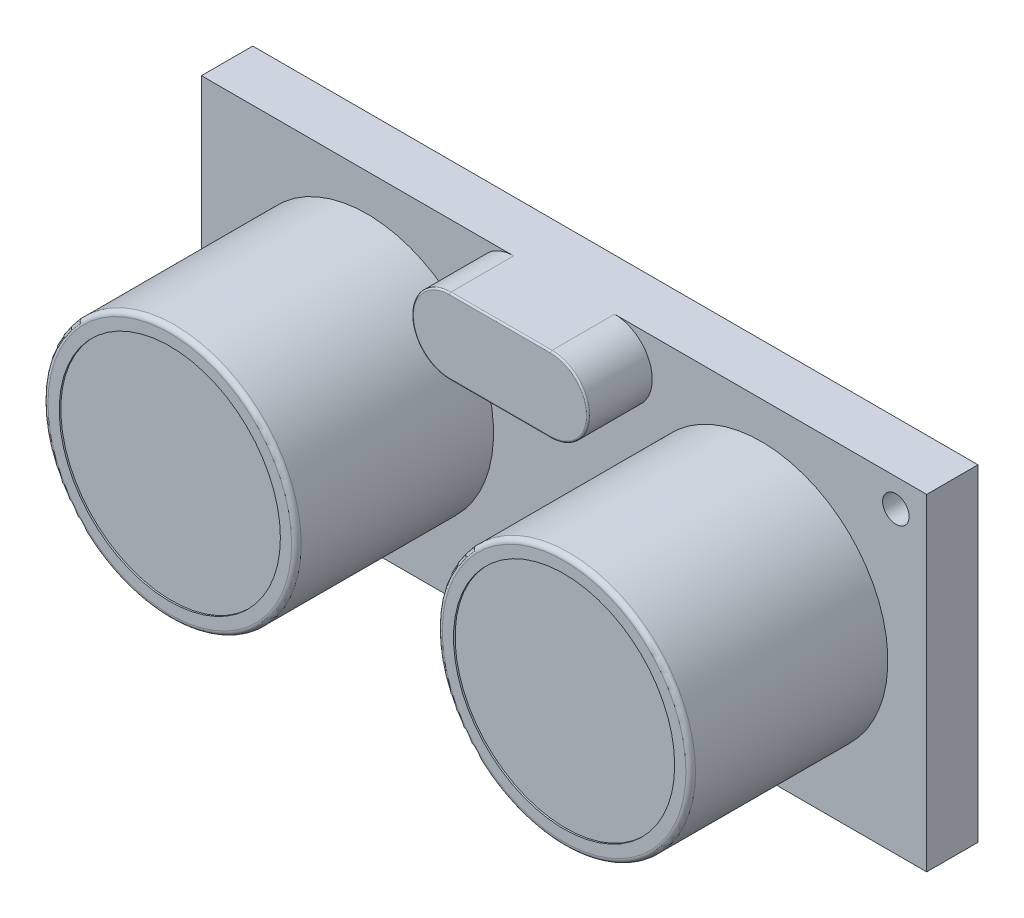
ISO-10303-21;
HEADER;
FILE_DESCRIPTION(('STEP AP214'),'2;1');
FILE_NAME('part.step','',(''),(''),'','','');
FILE_SCHEMA(('AUTOMOTIVE_DESIGN { 1 0 10303 214 1 1 1 1 }'));
ENDSEC;
DATA;
#1=APPLICATION_CONTEXT('core data for automotive mechanical design processes');
#2=APPLICATION_PROTOCOL_DEFINITION('international standard','automotive_design',2000,#1);
#3=PRODUCT_CONTEXT('',#1,'mechanical');
#4=PRODUCT('Part','Part','',(#3));
#5=PRODUCT_RELATED_PRODUCT_CATEGORY('part','',(#4));
#6=PRODUCT_DEFINITION_FORMATION('','',#4);
#7=PRODUCT_DEFINITION_CONTEXT('part definition',#1,'design');
#8=PRODUCT_DEFINITION('design','',#6,#7);
#9=PRODUCT_DEFINITION_SHAPE('','',#8);
#10=(LENGTH_UNIT() NAMED_UNIT(*) SI_UNIT(.MILLI.,.METRE.));
#11=(NAMED_UNIT(*) PLANE_ANGLE_UNIT() SI_UNIT($,.RADIAN.));
#12=(NAMED_UNIT(*) SI_UNIT($,.STERADIAN.) SOLID_ANGLE_UNIT());
#13=UNCERTAINTY_MEASURE_WITH_UNIT(LENGTH_MEASURE(1.E-05),#10,'distance_accuracy_value','');
#14=(GEOMETRIC_REPRESENTATION_CONTEXT(3) GLOBAL_UNCERTAINTY_ASSIGNED_CONTEXT((#13)) GLOBAL_UNIT_ASSIGNED_CONTEXT((#10,
#11,#12)) REPRESENTATION_CONTEXT('',''));
#15=CARTESIAN_POINT('',(0.,0.,0.));
#16=DIRECTION('',(0.,0.,1.));
#17=DIRECTION('',(1.,0.,0.));
#18=AXIS2_PLACEMENT_3D('',#15,#16,#17);
#19=CARTESIAN_POINT('',(-5.15,-7.7,-4.5));
#20=DIRECTION('',(1.,0.,0.));
#21=DIRECTION('',(0.,0.,-1.));
#22=AXIS2_PLACEMENT_3D('',#19,#20,#21);
#23=PLANE('',#22);
#24=DIRECTION('',(0.,1.,0.));
#25=VECTOR('',#24,1.);
#26=CARTESIAN_POINT('',(-5.15,-7.7,0.));
#27=LINE('',#26,#25);
#28=CARTESIAN_POINT('',(-5.15,-10.2,0.));
#29=VERTEX_POINT('',#28);
#30=CARTESIAN_POINT('',(-5.15,-7.7,0.));
#31=VERTEX_POINT('',#30);
#32=EDGE_CURVE('E111',#29,#31,#27,.T.);
#33=ORIENTED_EDGE('',*,*,#32,.T.);
#34=DIRECTION('',(0.,0.,1.));
#35=VECTOR('',#34,1.);
#36=CARTESIAN_POINT('',(-5.15,-7.7,-4.5));
#37=LINE('',#36,#35);
#38=CARTESIAN_POINT('',(-5.15,-7.7,-4.5));
#39=VERTEX_POINT('',#38);
#40=EDGE_CURVE('E102',#39,#31,#37,.T.);
#41=ORIENTED_EDGE('',*,*,#40,.F.);
#42=DIRECTION('',(0.,1.,0.));
#43=VECTOR('',#42,1.);
#44=CARTESIAN_POINT('',(-5.15,-7.7,-4.5));
#45=LINE('',#44,#43);
#46=CARTESIAN_POINT('',(-5.15,-10.2,-4.5));
#47=VERTEX_POINT('',#46);
#48=EDGE_CURVE('E96',#47,#39,#45,.T.);
#49=ORIENTED_EDGE('',*,*,#48,.F.);
#50=DIRECTION('',(0.,0.,1.));
#51=VECTOR('',#50,1.);
#52=CARTESIAN_POINT('',(-5.15,-10.2,-4.5));
#53=LINE('',#52,#51);
#54=EDGE_CURVE('E107',#47,#29,#53,.T.);
#55=ORIENTED_EDGE('',*,*,#54,.T.);
#56=EDGE_LOOP('',(#33,#41,#49,#55));
#57=FACE_BOUND('',#56,.T.);
#58=ADVANCED_FACE('F44',(#57),#23,.F.);
#59=CARTESIAN_POINT('',(5.15,-7.7,-4.5));
#60=DIRECTION('',(0.,-1.,0.));
#61=DIRECTION('',(0.,0.,-1.));
#62=AXIS2_PLACEMENT_3D('',#59,#60,#61);
#63=PLANE('',#62);
#64=DIRECTION('',(1.,0.,0.));
#65=VECTOR('',#64,1.);
#66=CARTESIAN_POINT('',(5.15,-7.7,0.));
#67=LINE('',#66,#65);
#68=CARTESIAN_POINT('',(5.15,-7.7,0.));
#69=VERTEX_POINT('',#68);
#70=EDGE_CURVE('E101',#31,#69,#67,.T.);
#71=ORIENTED_EDGE('',*,*,#70,.T.);
#72=DIRECTION('',(0.,0.,1.));
#73=VECTOR('',#72,1.);
#74=CARTESIAN_POINT('',(5.15,-7.7,-4.5));
#75=LINE('',#74,#73);
#76=CARTESIAN_POINT('',(5.15,-7.7,-4.5));
#77=VERTEX_POINT('',#76);
#78=EDGE_CURVE('E99',#77,#69,#75,.T.);
#79=ORIENTED_EDGE('',*,*,#78,.F.);
#80=DIRECTION('',(1.,0.,0.));
#81=VECTOR('',#80,1.);
#82=CARTESIAN_POINT('',(5.15,-7.7,-4.5));
#83=LINE('',#82,#81);
#84=EDGE_CURVE('E91',#39,#77,#83,.T.);
#85=ORIENTED_EDGE('',*,*,#84,.F.);
#86=ORIENTED_EDGE('',*,*,#40,.T.);
#87=EDGE_LOOP('',(#71,#79,#85,#86));
#88=FACE_BOUND('',#87,.T.);
#89=ADVANCED_FACE('F100',(#88),#63,.F.);
#90=CARTESIAN_POINT('',(5.15,-7.7,-4.5));
#91=DIRECTION('',(-1.,0.,0.));
#92=DIRECTION('',(0.,0.,1.));
#93=AXIS2_PLACEMENT_3D('',#90,#91,#92);
#94=PLANE('',#93);
#95=DIRECTION('',(0.,-1.,0.));
#96=VECTOR('',#95,1.);
#97=CARTESIAN_POINT('',(5.15,-7.7,0.));
#98=LINE('',#97,#96);
#99=CARTESIAN_POINT('',(5.15,-10.2,0.));
#100=VERTEX_POINT('',#99);
#101=EDGE_CURVE('E77',#69,#100,#98,.T.);
#102=ORIENTED_EDGE('',*,*,#101,.T.);
#103=DIRECTION('',(0.,0.,1.));
#104=VECTOR('',#103,1.);
#105=CARTESIAN_POINT('',(5.15,-10.2,-4.5));
#106=LINE('',#105,#104);
#107=CARTESIAN_POINT('',(5.15,-10.2,-4.5));
#108=VERTEX_POINT('',#107);
#109=EDGE_CURVE('E103',#108,#100,#106,.T.);
#110=ORIENTED_EDGE('',*,*,#109,.F.);
#111=DIRECTION('',(0.,-1.,0.));
#112=VECTOR('',#111,1.);
#113=CARTESIAN_POINT('',(5.15,-7.7,-4.5));
#114=LINE('',#113,#112);
#115=EDGE_CURVE('E94',#77,#108,#114,.T.);
#116=ORIENTED_EDGE('',*,*,#115,.F.);
#117=ORIENTED_EDGE('',*,*,#78,.T.);
#118=EDGE_LOOP('',(#102,#110,#116,#117));
#119=FACE_BOUND('',#118,.T.);
#120=ADVANCED_FACE('F105',(#119),#94,.F.);
#121=CARTESIAN_POINT('',(5.15,-10.2,-4.5));
#122=DIRECTION('',(0.,1.,0.));
#123=DIRECTION('',(0.,0.,1.));
#124=AXIS2_PLACEMENT_3D('',#121,#122,#123);
#125=PLANE('',#124);
#126=CARTESIAN_POINT('',(3.60521937867282,-10.2,-3.53307553741537));
#127=DIRECTION('',(0.,1.,0.));
#128=DIRECTION('',(0.,0.,1.));
#129=AXIS2_PLACEMENT_3D('',#126,#127,#128);
#130=CIRCLE('',#129,0.600934077009731);
#131=CARTESIAN_POINT('',(3.60521937867282,-10.2,-2.93214146040564));
#132=VERTEX_POINT('',#131);
#133=EDGE_CURVE('E12',#132,#132,#130,.F.);
#134=ORIENTED_EDGE('',*,*,#133,.F.);
#135=EDGE_LOOP('',(#134));
#136=FACE_BOUND('',#135,.T.);
#137=CARTESIAN_POINT('',(1.10521937867282,-10.2,-3.53307553741537));
#138=DIRECTION('',(0.,1.,0.));
#139=DIRECTION('',(0.,0.,1.));
#140=AXIS2_PLACEMENT_3D('',#137,#138,#139);
#141=CIRCLE('',#140,0.600934077009731);
#142=CARTESIAN_POINT('',(1.10521937867282,-10.2,-2.93214146040564));
#143=VERTEX_POINT('',#142);
#144=EDGE_CURVE('E52',#143,#143,#141,.F.);
#145=ORIENTED_EDGE('',*,*,#144,.F.);
#146=EDGE_LOOP('',(#145));
#147=FACE_BOUND('',#146,.T.);
#148=CARTESIAN_POINT('',(-1.39478062132718,-10.2,-3.53307553741537));
#149=DIRECTION('',(0.,1.,0.));
#150=DIRECTION('',(0.,0.,1.));
#151=AXIS2_PLACEMENT_3D('',#148,#149,#150);
#152=CIRCLE('',#151,0.600934077009731);
#153=CARTESIAN_POINT('',(-1.39478062132718,-10.2,-2.93214146040564));
#154=VERTEX_POINT('',#153);
#155=EDGE_CURVE('E124',#154,#154,#152,.F.);
#156=ORIENTED_EDGE('',*,*,#155,.F.);
#157=EDGE_LOOP('',(#156));
#158=FACE_BOUND('',#157,.T.);
#159=CARTESIAN_POINT('',(-3.89478062132718,-10.2,-3.53307553741537));
#160=DIRECTION('',(0.,1.,0.));
#161=DIRECTION('',(0.,0.,1.));
#162=AXIS2_PLACEMENT_3D('',#159,#160,#161);
#163=CIRCLE('',#162,0.600934077009731);
#164=CARTESIAN_POINT('',(-3.89478062132718,-10.2,-2.93214146040564));
#165=VERTEX_POINT('',#164);
#166=EDGE_CURVE('E121',#165,#165,#163,.F.);
#167=ORIENTED_EDGE('',*,*,#166,.F.);
#168=EDGE_LOOP('',(#167));
#169=FACE_BOUND('',#168,.T.);
#170=DIRECTION('',(-1.,0.,0.));
#171=VECTOR('',#170,1.);
#172=CARTESIAN_POINT('',(5.15,-10.2,0.));
#173=LINE('',#172,#171);
#174=EDGE_CURVE('E83',#100,#29,#173,.T.);
#175=ORIENTED_EDGE('',*,*,#174,.T.);
#176=ORIENTED_EDGE('',*,*,#54,.F.);
#177=DIRECTION('',(-1.,0.,0.));
#178=VECTOR('',#177,1.);
#179=CARTESIAN_POINT('',(5.15,-10.2,-4.5));
#180=LINE('',#179,#178);
#181=EDGE_CURVE('E60',#108,#47,#180,.T.);
#182=ORIENTED_EDGE('',*,*,#181,.F.);
#183=ORIENTED_EDGE('',*,*,#109,.T.);
#184=EDGE_LOOP('',(#175,#176,#182,#183));
#185=FACE_BOUND('',#184,.T.);
#186=ADVANCED_FACE('F131',(#136,#147,#158,#169,#185),#125,.F.);
#187=CARTESIAN_POINT('',(0.,0.,-4.5));
#188=DIRECTION('',(0.,0.,-1.));
#189=DIRECTION('',(-1.,0.,0.));
#190=AXIS2_PLACEMENT_3D('',#187,#188,#189);
#191=PLANE('',#190);
#192=ORIENTED_EDGE('',*,*,#48,.T.);
#193=ORIENTED_EDGE('',*,*,#84,.T.);
#194=ORIENTED_EDGE('',*,*,#115,.T.);
#195=ORIENTED_EDGE('',*,*,#181,.T.);
#196=EDGE_LOOP('',(#192,#193,#194,#195));
#197=FACE_BOUND('',#196,.T.);
#198=ADVANCED_FACE('F92',(#197),#191,.T.);
#199=CARTESIAN_POINT('',(0.,0.,0.));
#200=DIRECTION('',(0.,0.,-1.));
#201=DIRECTION('',(-1.,0.,0.));
#202=AXIS2_PLACEMENT_3D('',#199,#200,#201);
#203=PLANE('',#202);
#204=ORIENTED_EDGE('',*,*,#32,.F.);
#205=ORIENTED_EDGE('',*,*,#174,.F.);
#206=ORIENTED_EDGE('',*,*,#101,.F.);
#207=ORIENTED_EDGE('',*,*,#70,.F.);
#208=EDGE_LOOP('',(#204,#205,#206,#207));
#209=FACE_BOUND('',#208,.T.);
#210=ADVANCED_FACE('F143',(#209),#203,.F.);
#211=CARTESIAN_POINT('',(-3.89478062132718,-18.2,-3.53307553741537));
#212=DIRECTION('',(0.,1.,0.));
#213=DIRECTION('',(0.,0.,1.));
#214=AXIS2_PLACEMENT_3D('',#211,#212,#213);
#215=CYLINDRICAL_SURFACE('',#214,0.600934077009731);
#216=CARTESIAN_POINT('',(-3.89478062132718,-18.2,-3.53307553741537));
#217=DIRECTION('',(0.,-1.,0.));
#218=DIRECTION('',(0.,0.,-1.));
#219=AXIS2_PLACEMENT_3D('',#216,#217,#218);
#220=CIRCLE('',#219,0.600934077009731);
#221=CARTESIAN_POINT('',(-3.89478062132718,-18.2,-4.1340096144251));
#222=VERTEX_POINT('',#221);
#223=EDGE_CURVE('E114',#222,#222,#220,.T.);
#224=ORIENTED_EDGE('',*,*,#223,.F.);
#225=EDGE_LOOP('',(#224));
#226=FACE_BOUND('',#225,.T.);
#227=ORIENTED_EDGE('',*,*,#166,.T.);
#228=EDGE_LOOP('',(#227));
#229=FACE_BOUND('',#228,.T.);
#230=ADVANCED_FACE('F140',(#226,#229),#215,.T.);
#231=CARTESIAN_POINT('',(-3.89478062132718,-18.2,-3.53307553741537));
#232=DIRECTION('',(0.,-1.,0.));
#233=DIRECTION('',(0.,0.,-1.));
#234=AXIS2_PLACEMENT_3D('',#231,#232,#233);
#235=PLANE('',#234);
#236=ORIENTED_EDGE('',*,*,#223,.T.);
#237=EDGE_LOOP('',(#236));
#238=FACE_BOUND('',#237,.T.);
#239=ADVANCED_FACE('F142',(#238),#235,.T.);
#240=CARTESIAN_POINT('',(-1.39478062132718,-18.2,-3.53307553741537));
#241=DIRECTION('',(0.,1.,0.));
#242=DIRECTION('',(0.,0.,1.));
#243=AXIS2_PLACEMENT_3D('',#240,#241,#242);
#244=CYLINDRICAL_SURFACE('',#243,0.600934077009731);
#245=CARTESIAN_POINT('',(-1.39478062132718,-18.2,-3.53307553741537));
#246=DIRECTION('',(0.,-1.,0.));
#247=DIRECTION('',(0.,0.,-1.));
#248=AXIS2_PLACEMENT_3D('',#245,#246,#247);
#249=CIRCLE('',#248,0.600934077009731);
#250=CARTESIAN_POINT('',(-1.39478062132718,-18.2,-4.1340096144251));
#251=VERTEX_POINT('',#250);
#252=EDGE_CURVE('E166',#251,#251,#249,.T.);
#253=ORIENTED_EDGE('',*,*,#252,.F.);
#254=EDGE_LOOP('',(#253));
#255=FACE_BOUND('',#254,.T.);
#256=ORIENTED_EDGE('',*,*,#155,.T.);
#257=EDGE_LOOP('',(#256));
#258=FACE_BOUND('',#257,.T.);
#259=ADVANCED_FACE('F150',(#255,#258),#244,.T.);
#260=CARTESIAN_POINT('',(-1.39478062132718,-18.2,-3.53307553741537));
#261=DIRECTION('',(0.,-1.,0.));
#262=DIRECTION('',(0.,0.,-1.));
#263=AXIS2_PLACEMENT_3D('',#260,#261,#262);
#264=PLANE('',#263);
#265=ORIENTED_EDGE('',*,*,#252,.T.);
#266=EDGE_LOOP('',(#265));
#267=FACE_BOUND('',#266,.T.);
#268=ADVANCED_FACE('F194',(#267),#264,.T.);
#269=CARTESIAN_POINT('',(1.10521937867282,-18.2,-3.53307553741537));
#270=DIRECTION('',(0.,1.,0.));
#271=DIRECTION('',(0.,0.,1.));
#272=AXIS2_PLACEMENT_3D('',#269,#270,#271);
#273=CYLINDRICAL_SURFACE('',#272,0.600934077009731);
#274=CARTESIAN_POINT('',(1.10521937867282,-18.2,-3.53307553741537));
#275=DIRECTION('',(0.,-1.,0.));
#276=DIRECTION('',(0.,0.,-1.));
#277=AXIS2_PLACEMENT_3D('',#274,#275,#276);
#278=CIRCLE('',#277,0.600934077009731);
#279=CARTESIAN_POINT('',(1.10521937867282,-18.2,-4.1340096144251));
#280=VERTEX_POINT('',#279);
#281=EDGE_CURVE('E169',#280,#280,#278,.T.);
#282=ORIENTED_EDGE('',*,*,#281,.F.);
#283=EDGE_LOOP('',(#282));
#284=FACE_BOUND('',#283,.T.);
#285=ORIENTED_EDGE('',*,*,#144,.T.);
#286=EDGE_LOOP('',(#285));
#287=FACE_BOUND('',#286,.T.);
#288=ADVANCED_FACE('F129',(#284,#287),#273,.T.);
#289=CARTESIAN_POINT('',(1.10521937867282,-18.2,-3.53307553741537));
#290=DIRECTION('',(0.,-1.,0.));
#291=DIRECTION('',(0.,0.,-1.));
#292=AXIS2_PLACEMENT_3D('',#289,#290,#291);
#293=PLANE('',#292);
#294=ORIENTED_EDGE('',*,*,#281,.T.);
#295=EDGE_LOOP('',(#294));
#296=FACE_BOUND('',#295,.T.);
#297=ADVANCED_FACE('F181',(#296),#293,.T.);
#298=CARTESIAN_POINT('',(3.60521937867282,-18.2,-3.53307553741537));
#299=DIRECTION('',(0.,1.,0.));
#300=DIRECTION('',(0.,0.,1.));
#301=AXIS2_PLACEMENT_3D('',#298,#299,#300);
#302=CYLINDRICAL_SURFACE('',#301,0.600934077009731);
#303=CARTESIAN_POINT('',(3.60521937867282,-18.2,-3.53307553741537));
#304=DIRECTION('',(0.,-1.,0.));
#305=DIRECTION('',(0.,0.,-1.));
#306=AXIS2_PLACEMENT_3D('',#303,#304,#305);
#307=CIRCLE('',#306,0.600934077009731);
#308=CARTESIAN_POINT('',(3.60521937867282,-18.2,-4.1340096144251));
#309=VERTEX_POINT('',#308);
#310=EDGE_CURVE('E172',#309,#309,#307,.T.);
#311=ORIENTED_EDGE('',*,*,#310,.F.);
#312=EDGE_LOOP('',(#311));
#313=FACE_BOUND('',#312,.T.);
#314=ORIENTED_EDGE('',*,*,#133,.T.);
#315=EDGE_LOOP('',(#314));
#316=FACE_BOUND('',#315,.T.);
#317=ADVANCED_FACE('F178',(#313,#316),#302,.T.);
#318=CARTESIAN_POINT('',(3.60521937867282,-18.2,-3.53307553741537));
#319=DIRECTION('',(0.,-1.,0.));
#320=DIRECTION('',(0.,0.,-1.));
#321=AXIS2_PLACEMENT_3D('',#318,#319,#320);
#322=PLANE('',#321);
#323=ORIENTED_EDGE('',*,*,#310,.T.);
#324=EDGE_LOOP('',(#323));
#325=FACE_BOUND('',#324,.T.);
#326=ADVANCED_FACE('F176',(#325),#322,.T.);
#327=CLOSED_SHELL('',(#58,#89,#120,#186,#198,#210,#230,#239,#259,#268,#288,#297,#317,#326));
#328=MANIFOLD_SOLID_BREP('B2',#327);
#329=CARTESIAN_POINT('',(0.,0.,3.2));
#330=DIRECTION('',(0.,0.,-1.));
#331=DIRECTION('',(-1.,0.,0.));
#332=AXIS2_PLACEMENT_3D('',#329,#330,#331);
#333=PLANE('',#332);
#334=CARTESIAN_POINT('',(-20.7,-8.45,3.2));
#335=DIRECTION('',(0.,0.,-1.));
#336=DIRECTION('',(-1.,0.,0.));
#337=AXIS2_PLACEMENT_3D('',#334,#335,#336);
#338=CIRCLE('',#337,0.824999999999998);
#339=CARTESIAN_POINT('',(-21.525,-8.45,3.2));
#340=VERTEX_POINT('',#339);
#341=EDGE_CURVE('E645',#340,#340,#338,.T.);
#342=ORIENTED_EDGE('',*,*,#341,.T.);
#343=EDGE_LOOP('',(#342));
#344=FACE_BOUND('',#343,.T.);
#345=CARTESIAN_POINT('',(20.7,8.45,3.2));
#346=DIRECTION('',(0.,0.,-1.));
#347=DIRECTION('',(-1.,0.,0.));
#348=AXIS2_PLACEMENT_3D('',#345,#346,#347);
#349=CIRCLE('',#348,0.824999999999998);
#350=CARTESIAN_POINT('',(19.875,8.45,3.2));
#351=VERTEX_POINT('',#350);
#352=EDGE_CURVE('E626',#351,#351,#349,.T.);
#353=ORIENTED_EDGE('',*,*,#352,.T.);
#354=EDGE_LOOP('',(#353));
#355=FACE_BOUND('',#354,.T.);
#356=CARTESIAN_POINT('',(-3.15,7.85000000000001,3.2));
#357=DIRECTION('',(0.,0.,1.));
#358=DIRECTION('',(1.,0.,0.));
#359=AXIS2_PLACEMENT_3D('',#356,#357,#358);
#360=CIRCLE('',#359,2.34999999999999);
#361=CARTESIAN_POINT('',(-3.15,10.2,3.2));
#362=VERTEX_POINT('',#361);
#363=CARTESIAN_POINT('',(-3.15,5.50000000000001,3.2));
#364=VERTEX_POINT('',#363);
#365=EDGE_CURVE('E427',#362,#364,#360,.T.);
#366=ORIENTED_EDGE('',*,*,#365,.F.);
#367=DIRECTION('',(-1.,0.,0.));
#368=VECTOR('',#367,1.);
#369=CARTESIAN_POINT('',(-22.625,10.2,3.2));
#370=LINE('',#369,#368);
#371=CARTESIAN_POINT('',(-22.625,10.2,3.2));
#372=VERTEX_POINT('',#371);
#373=EDGE_CURVE('E449',#362,#372,#370,.T.);
#374=ORIENTED_EDGE('',*,*,#373,.T.);
#375=DIRECTION('',(0.,-1.,0.));
#376=VECTOR('',#375,1.);
#377=CARTESIAN_POINT('',(-22.625,-10.2,3.2));
#378=LINE('',#377,#376);
#379=CARTESIAN_POINT('',(-22.625,-10.2,3.2));
#380=VERTEX_POINT('',#379);
#381=EDGE_CURVE('E454',#372,#380,#378,.T.);
#382=ORIENTED_EDGE('',*,*,#381,.T.);
#383=DIRECTION('',(1.,0.,0.));
#384=VECTOR('',#383,1.);
#385=CARTESIAN_POINT('',(-22.625,-10.2,3.2));
#386=LINE('',#385,#384);
#387=CARTESIAN_POINT('',(22.625,-10.2,3.2));
#388=VERTEX_POINT('',#387);
#389=EDGE_CURVE('E456',#380,#388,#386,.T.);
#390=ORIENTED_EDGE('',*,*,#389,.T.);
#391=DIRECTION('',(0.,1.,0.));
#392=VECTOR('',#391,1.);
#393=CARTESIAN_POINT('',(22.625,-10.2,3.2));
#394=LINE('',#393,#392);
#395=CARTESIAN_POINT('',(22.625,10.2,3.2));
#396=VERTEX_POINT('',#395);
#397=EDGE_CURVE('E446',#388,#396,#394,.T.);
#398=ORIENTED_EDGE('',*,*,#397,.T.);
#399=CARTESIAN_POINT('',(3.15,10.2,3.2));
#400=VERTEX_POINT('',#399);
#401=EDGE_CURVE('E451',#396,#400,#370,.T.);
#402=ORIENTED_EDGE('',*,*,#401,.T.);
#403=CARTESIAN_POINT('',(3.15,7.85000000000001,3.2));
#404=DIRECTION('',(0.,0.,1.));
#405=DIRECTION('',(1.,0.,0.));
#406=AXIS2_PLACEMENT_3D('',#403,#404,#405);
#407=CIRCLE('',#406,2.34999999999999);
#408=CARTESIAN_POINT('',(3.15,5.50000000000001,3.2));
#409=VERTEX_POINT('',#408);
#410=EDGE_CURVE('E434',#409,#400,#407,.T.);
#411=ORIENTED_EDGE('',*,*,#410,.F.);
#412=DIRECTION('',(1.,0.,0.));
#413=VECTOR('',#412,1.);
#414=CARTESIAN_POINT('',(-3.15,5.50000000000001,3.2));
#415=LINE('',#414,#413);
#416=EDGE_CURVE('E430',#364,#409,#415,.T.);
#417=ORIENTED_EDGE('',*,*,#416,.F.);
#418=EDGE_LOOP('',(#366,#374,#382,#390,#398,#402,#411,#417));
#419=FACE_BOUND('',#418,.T.);
#420=CARTESIAN_POINT('',(-12.3,0.,3.2));
#421=DIRECTION('',(0.,0.,-1.));
#422=DIRECTION('',(-1.,0.,0.));
#423=AXIS2_PLACEMENT_3D('',#420,#421,#422);
#424=CIRCLE('',#423,7.9);
#425=CARTESIAN_POINT('',(-20.2,0.,3.2));
#426=VERTEX_POINT('',#425);
#427=EDGE_CURVE('E495',#426,#426,#424,.F.);
#428=ORIENTED_EDGE('',*,*,#427,.F.);
#429=EDGE_LOOP('',(#428));
#430=FACE_BOUND('',#429,.T.);
#431=CARTESIAN_POINT('',(12.3,0.,3.2));
#432=DIRECTION('',(0.,0.,-1.));
#433=DIRECTION('',(-1.,0.,0.));
#434=AXIS2_PLACEMENT_3D('',#431,#432,#433);
#435=CIRCLE('',#434,7.9);
#436=CARTESIAN_POINT('',(4.39999999999999,0.,3.2));
#437=VERTEX_POINT('',#436);
#438=EDGE_CURVE('E506',#437,#437,#435,.F.);
#439=ORIENTED_EDGE('',*,*,#438,.F.);
#440=EDGE_LOOP('',(#439));
#441=FACE_BOUND('',#440,.T.);
#442=DIRECTION('',(0.,1.,0.));
#443=VECTOR('',#442,1.);
#444=CARTESIAN_POINT('',(5.30253265313219,-7.85994884424464,3.2));
#445=LINE('',#444,#443);
#446=CARTESIAN_POINT('',(5.30253265313219,-8.61074992787398,3.2));
#447=VERTEX_POINT('',#446);
#448=CARTESIAN_POINT('',(5.30253265313219,-7.85994884424464,3.2));
#449=VERTEX_POINT('',#448);
#450=EDGE_CURVE('E408',#447,#449,#445,.T.);
#451=ORIENTED_EDGE('',*,*,#450,.F.);
#452=DIRECTION('',(1.,0.,0.));
#453=VECTOR('',#452,1.);
#454=CARTESIAN_POINT('',(-5.30253265313219,-8.61074992787398,3.2));
#455=LINE('',#454,#453);
#456=CARTESIAN_POINT('',(-5.30253265313219,-8.61074992787398,3.2));
#457=VERTEX_POINT('',#456);
#458=EDGE_CURVE('E405',#457,#447,#455,.T.);
#459=ORIENTED_EDGE('',*,*,#458,.F.);
#460=DIRECTION('',(0.,-1.,0.));
#461=VECTOR('',#460,1.);
#462=CARTESIAN_POINT('',(-5.30253265313219,-7.85994884424464,3.2));
#463=LINE('',#462,#461);
#464=CARTESIAN_POINT('',(-5.30253265313219,-7.85994884424464,3.2));
#465=VERTEX_POINT('',#464);
#466=EDGE_CURVE('E307',#465,#457,#463,.T.);
#467=ORIENTED_EDGE('',*,*,#466,.F.);
#468=DIRECTION('',(-1.,0.,0.));
#469=VECTOR('',#468,1.);
#470=CARTESIAN_POINT('',(-5.30253265313219,-7.85994884424464,3.2));
#471=LINE('',#470,#469);
#472=EDGE_CURVE('E302',#449,#465,#471,.T.);
#473=ORIENTED_EDGE('',*,*,#472,.F.);
#474=EDGE_LOOP('',(#451,#459,#467,#473));
#475=FACE_BOUND('',#474,.T.);
#476=ADVANCED_FACE('F287',(#344,#355,#419,#430,#441,#475),#333,.F.);
#477=CARTESIAN_POINT('',(22.625,-10.2,3.2));
#478=DIRECTION('',(-1.,0.,0.));
#479=DIRECTION('',(0.,0.,1.));
#480=AXIS2_PLACEMENT_3D('',#477,#478,#479);
#481=PLANE('',#480);
#482=DIRECTION('',(0.,1.,0.));
#483=VECTOR('',#482,1.);
#484=CARTESIAN_POINT('',(22.625,-10.2,0.));
#485=LINE('',#484,#483);
#486=CARTESIAN_POINT('',(22.625,-10.2,0.));
#487=VERTEX_POINT('',#486);
#488=CARTESIAN_POINT('',(22.625,10.2,0.));
#489=VERTEX_POINT('',#488);
#490=EDGE_CURVE('E445',#487,#489,#485,.T.);
#491=ORIENTED_EDGE('',*,*,#490,.T.);
#492=DIRECTION('',(0.,0.,-1.));
#493=VECTOR('',#492,1.);
#494=CARTESIAN_POINT('',(22.625,10.2,3.2));
#495=LINE('',#494,#493);
#496=EDGE_CURVE('E474',#396,#489,#495,.T.);
#497=ORIENTED_EDGE('',*,*,#496,.F.);
#498=ORIENTED_EDGE('',*,*,#397,.F.);
#499=DIRECTION('',(0.,0.,-1.));
#500=VECTOR('',#499,1.);
#501=CARTESIAN_POINT('',(22.625,-10.2,3.2));
#502=LINE('',#501,#500);
#503=EDGE_CURVE('E458',#388,#487,#502,.T.);
#504=ORIENTED_EDGE('',*,*,#503,.T.);
#505=EDGE_LOOP('',(#491,#497,#498,#504));
#506=FACE_BOUND('',#505,.T.);
#507=ADVANCED_FACE('F532',(#506),#481,.F.);
#508=CARTESIAN_POINT('',(-22.625,10.2,3.2));
#509=DIRECTION('',(0.,-1.,0.));
#510=DIRECTION('',(0.,0.,-1.));
#511=AXIS2_PLACEMENT_3D('',#508,#509,#510);
#512=PLANE('',#511);
#513=DIRECTION('',(0.,0.,-1.));
#514=VECTOR('',#513,1.);
#515=CARTESIAN_POINT('',(-3.15,10.2,7.2));
#516=LINE('',#515,#514);
#517=CARTESIAN_POINT('',(-3.15,10.2,7.1));
#518=VERTEX_POINT('',#517);
#519=EDGE_CURVE('E437',#518,#362,#516,.T.);
#520=ORIENTED_EDGE('',*,*,#519,.F.);
#521=DIRECTION('',(-1.,0.,0.));
#522=VECTOR('',#521,1.);
#523=CARTESIAN_POINT('',(3.15,10.2,7.1));
#524=LINE('',#523,#522);
#525=CARTESIAN_POINT('',(3.15,10.2,7.1));
#526=VERTEX_POINT('',#525);
#527=EDGE_CURVE('E486',#518,#526,#524,.F.);
#528=ORIENTED_EDGE('',*,*,#527,.T.);
#529=DIRECTION('',(0.,0.,-1.));
#530=VECTOR('',#529,1.);
#531=CARTESIAN_POINT('',(3.15,10.2,7.2));
#532=LINE('',#531,#530);
#533=EDGE_CURVE('E439',#526,#400,#532,.T.);
#534=ORIENTED_EDGE('',*,*,#533,.T.);
#535=ORIENTED_EDGE('',*,*,#401,.F.);
#536=ORIENTED_EDGE('',*,*,#496,.T.);
#537=DIRECTION('',(-1.,0.,0.));
#538=VECTOR('',#537,1.);
#539=CARTESIAN_POINT('',(-22.625,10.2,0.));
#540=LINE('',#539,#538);
#541=CARTESIAN_POINT('',(-22.625,10.2,0.));
#542=VERTEX_POINT('',#541);
#543=EDGE_CURVE('E461',#489,#542,#540,.T.);
#544=ORIENTED_EDGE('',*,*,#543,.T.);
#545=DIRECTION('',(0.,0.,-1.));
#546=VECTOR('',#545,1.);
#547=CARTESIAN_POINT('',(-22.625,10.2,3.2));
#548=LINE('',#547,#546);
#549=EDGE_CURVE('E471',#372,#542,#548,.T.);
#550=ORIENTED_EDGE('',*,*,#549,.F.);
#551=ORIENTED_EDGE('',*,*,#373,.F.);
#552=EDGE_LOOP('',(#520,#528,#534,#535,#536,#544,#550,#551));
#553=FACE_BOUND('',#552,.T.);
#554=ADVANCED_FACE('F538',(#553),#512,.F.);
#555=CARTESIAN_POINT('',(-22.625,-10.2,3.2));
#556=DIRECTION('',(1.,0.,0.));
#557=DIRECTION('',(0.,0.,-1.));
#558=AXIS2_PLACEMENT_3D('',#555,#556,#557);
#559=PLANE('',#558);
#560=DIRECTION('',(0.,-1.,0.));
#561=VECTOR('',#560,1.);
#562=CARTESIAN_POINT('',(-22.625,-10.2,0.));
#563=LINE('',#562,#561);
#564=CARTESIAN_POINT('',(-22.625,-10.2,0.));
#565=VERTEX_POINT('',#564);
#566=EDGE_CURVE('E463',#542,#565,#563,.T.);
#567=ORIENTED_EDGE('',*,*,#566,.T.);
#568=DIRECTION('',(0.,0.,-1.));
#569=VECTOR('',#568,1.);
#570=CARTESIAN_POINT('',(-22.625,-10.2,3.2));
#571=LINE('',#570,#569);
#572=EDGE_CURVE('E468',#380,#565,#571,.T.);
#573=ORIENTED_EDGE('',*,*,#572,.F.);
#574=ORIENTED_EDGE('',*,*,#381,.F.);
#575=ORIENTED_EDGE('',*,*,#549,.T.);
#576=EDGE_LOOP('',(#567,#573,#574,#575));
#577=FACE_BOUND('',#576,.T.);
#578=ADVANCED_FACE('F554',(#577),#559,.F.);
#579=CARTESIAN_POINT('',(-22.625,-10.2,3.2));
#580=DIRECTION('',(0.,1.,0.));
#581=DIRECTION('',(0.,0.,1.));
#582=AXIS2_PLACEMENT_3D('',#579,#580,#581);
#583=PLANE('',#582);
#584=DIRECTION('',(1.,0.,0.));
#585=VECTOR('',#584,1.);
#586=CARTESIAN_POINT('',(-22.625,-10.2,0.));
#587=LINE('',#586,#585);
#588=EDGE_CURVE('E450',#565,#487,#587,.T.);
#589=ORIENTED_EDGE('',*,*,#588,.T.);
#590=ORIENTED_EDGE('',*,*,#503,.F.);
#591=ORIENTED_EDGE('',*,*,#389,.F.);
#592=ORIENTED_EDGE('',*,*,#572,.T.);
#593=EDGE_LOOP('',(#589,#590,#591,#592));
#594=FACE_BOUND('',#593,.T.);
#595=ADVANCED_FACE('F550',(#594),#583,.F.);
#596=CARTESIAN_POINT('',(0.,0.,0.));
#597=DIRECTION('',(0.,0.,-1.));
#598=DIRECTION('',(-1.,0.,0.));
#599=AXIS2_PLACEMENT_3D('',#596,#597,#598);
#600=PLANE('',#599);
#601=CARTESIAN_POINT('',(-20.7,-8.45,0.));
#602=DIRECTION('',(0.,0.,-1.));
#603=DIRECTION('',(-1.,0.,0.));
#604=AXIS2_PLACEMENT_3D('',#601,#602,#603);
#605=CIRCLE('',#604,0.824999999999998);
#606=CARTESIAN_POINT('',(-21.525,-8.45,0.));
#607=VERTEX_POINT('',#606);
#608=EDGE_CURVE('E647',#607,#607,#605,.T.);
#609=ORIENTED_EDGE('',*,*,#608,.F.);
#610=EDGE_LOOP('',(#609));
#611=FACE_BOUND('',#610,.T.);
#612=CARTESIAN_POINT('',(20.7,8.45,0.));
#613=DIRECTION('',(0.,0.,-1.));
#614=DIRECTION('',(-1.,0.,0.));
#615=AXIS2_PLACEMENT_3D('',#612,#613,#614);
#616=CIRCLE('',#615,0.824999999999998);
#617=CARTESIAN_POINT('',(19.875,8.45,0.));
#618=VERTEX_POINT('',#617);
#619=EDGE_CURVE('E642',#618,#618,#616,.T.);
#620=ORIENTED_EDGE('',*,*,#619,.F.);
#621=EDGE_LOOP('',(#620));
#622=FACE_BOUND('',#621,.T.);
#623=ORIENTED_EDGE('',*,*,#490,.F.);
#624=ORIENTED_EDGE('',*,*,#588,.F.);
#625=ORIENTED_EDGE('',*,*,#566,.F.);
#626=ORIENTED_EDGE('',*,*,#543,.F.);
#627=EDGE_LOOP('',(#623,#624,#625,#626));
#628=FACE_BOUND('',#627,.T.);
#629=ADVANCED_FACE('F547',(#611,#622,#628),#600,.T.);
#630=CARTESIAN_POINT('',(-3.15,7.85000000000001,7.2));
#631=DIRECTION('',(0.,0.,-1.));
#632=DIRECTION('',(-1.,0.,0.));
#633=AXIS2_PLACEMENT_3D('',#630,#631,#632);
#634=CYLINDRICAL_SURFACE('',#633,2.34999999999999);
#635=DIRECTION('',(0.,0.,-1.));
#636=VECTOR('',#635,1.);
#637=CARTESIAN_POINT('',(-3.15,5.50000000000001,7.2));
#638=LINE('',#637,#636);
#639=CARTESIAN_POINT('',(-3.15,5.50000000000001,7.1));
#640=VERTEX_POINT('',#639);
#641=EDGE_CURVE('E443',#640,#364,#638,.T.);
#642=ORIENTED_EDGE('',*,*,#641,.F.);
#643=CARTESIAN_POINT('',(-3.15,7.85000000000001,7.1));
#644=DIRECTION('',(0.,0.,1.));
#645=DIRECTION('',(1.,0.,0.));
#646=AXIS2_PLACEMENT_3D('',#643,#644,#645);
#647=CIRCLE('',#646,2.34999999999999);
#648=EDGE_CURVE('E493',#640,#518,#647,.F.);
#649=ORIENTED_EDGE('',*,*,#648,.T.);
#650=ORIENTED_EDGE('',*,*,#519,.T.);
#651=ORIENTED_EDGE('',*,*,#365,.T.);
#652=EDGE_LOOP('',(#642,#649,#650,#651));
#653=FACE_BOUND('',#652,.T.);
#654=ADVANCED_FACE('F545',(#653),#634,.T.);
#655=CARTESIAN_POINT('',(-3.15,5.50000000000001,7.2));
#656=DIRECTION('',(0.,1.,0.));
#657=DIRECTION('',(0.,0.,1.));
#658=AXIS2_PLACEMENT_3D('',#655,#656,#657);
#659=PLANE('',#658);
#660=DIRECTION('',(0.,0.,-1.));
#661=VECTOR('',#660,1.);
#662=CARTESIAN_POINT('',(3.15,5.50000000000001,7.2));
#663=LINE('',#662,#661);
#664=CARTESIAN_POINT('',(3.15,5.50000000000001,7.1));
#665=VERTEX_POINT('',#664);
#666=EDGE_CURVE('E441',#665,#409,#663,.T.);
#667=ORIENTED_EDGE('',*,*,#666,.F.);
#668=DIRECTION('',(1.,0.,0.));
#669=VECTOR('',#668,1.);
#670=CARTESIAN_POINT('',(-3.15,5.50000000000001,7.1));
#671=LINE('',#670,#669);
#672=EDGE_CURVE('E491',#665,#640,#671,.F.);
#673=ORIENTED_EDGE('',*,*,#672,.T.);
#674=ORIENTED_EDGE('',*,*,#641,.T.);
#675=ORIENTED_EDGE('',*,*,#416,.T.);
#676=EDGE_LOOP('',(#667,#673,#674,#675));
#677=FACE_BOUND('',#676,.T.);
#678=ADVANCED_FACE('F608',(#677),#659,.F.);
#679=CARTESIAN_POINT('',(3.15,7.85000000000001,7.2));
#680=DIRECTION('',(0.,0.,-1.));
#681=DIRECTION('',(-1.,0.,0.));
#682=AXIS2_PLACEMENT_3D('',#679,#680,#681);
#683=CYLINDRICAL_SURFACE('',#682,2.34999999999999);
#684=ORIENTED_EDGE('',*,*,#533,.F.);
#685=CARTESIAN_POINT('',(3.15,7.85000000000001,7.1));
#686=DIRECTION('',(0.,0.,1.));
#687=DIRECTION('',(1.,0.,0.));
#688=AXIS2_PLACEMENT_3D('',#685,#686,#687);
#689=CIRCLE('',#688,2.34999999999999);
#690=EDGE_CURVE('E489',#526,#665,#689,.F.);
#691=ORIENTED_EDGE('',*,*,#690,.T.);
#692=ORIENTED_EDGE('',*,*,#666,.T.);
#693=ORIENTED_EDGE('',*,*,#410,.T.);
#694=EDGE_LOOP('',(#684,#691,#692,#693));
#695=FACE_BOUND('',#694,.T.);
#696=ADVANCED_FACE('F582',(#695),#683,.T.);
#697=CARTESIAN_POINT('',(-3.15,7.85000000000001,7.2));
#698=DIRECTION('',(0.,0.,1.));
#699=DIRECTION('',(1.,0.,0.));
#700=AXIS2_PLACEMENT_3D('',#697,#698,#699);
#701=PLANE('',#700);
#702=CARTESIAN_POINT('',(3.15,7.85000000000001,7.2));
#703=DIRECTION('',(0.,0.,1.));
#704=DIRECTION('',(1.,0.,0.));
#705=AXIS2_PLACEMENT_3D('',#702,#703,#704);
#706=CIRCLE('',#705,2.24999999999999);
#707=CARTESIAN_POINT('',(3.15,5.60000000000001,7.2));
#708=VERTEX_POINT('',#707);
#709=CARTESIAN_POINT('',(3.15,10.1,7.2));
#710=VERTEX_POINT('',#709);
#711=EDGE_CURVE('E481',#708,#710,#706,.T.);
#712=ORIENTED_EDGE('',*,*,#711,.T.);
#713=DIRECTION('',(-1.,0.,0.));
#714=VECTOR('',#713,1.);
#715=CARTESIAN_POINT('',(-3.15,10.1,7.2));
#716=LINE('',#715,#714);
#717=CARTESIAN_POINT('',(-3.15,10.1,7.2));
#718=VERTEX_POINT('',#717);
#719=EDGE_CURVE('E483',#710,#718,#716,.T.);
#720=ORIENTED_EDGE('',*,*,#719,.T.);
#721=CARTESIAN_POINT('',(-3.15,7.85000000000001,7.2));
#722=DIRECTION('',(0.,0.,1.));
#723=DIRECTION('',(1.,0.,0.));
#724=AXIS2_PLACEMENT_3D('',#721,#722,#723);
#725=CIRCLE('',#724,2.24999999999999);
#726=CARTESIAN_POINT('',(-3.15,5.60000000000001,7.2));
#727=VERTEX_POINT('',#726);
#728=EDGE_CURVE('E477',#718,#727,#725,.T.);
#729=ORIENTED_EDGE('',*,*,#728,.T.);
#730=DIRECTION('',(1.,0.,0.));
#731=VECTOR('',#730,1.);
#732=CARTESIAN_POINT('',(3.15,5.60000000000001,7.2));
#733=LINE('',#732,#731);
#734=EDGE_CURVE('E479',#727,#708,#733,.T.);
#735=ORIENTED_EDGE('',*,*,#734,.T.);
#736=EDGE_LOOP('',(#712,#720,#729,#735));
#737=FACE_BOUND('',#736,.T.);
#738=ADVANCED_FACE('F577',(#737),#701,.T.);
#739=CARTESIAN_POINT('',(-3.15,5.60000000000001,7.1));
#740=DIRECTION('',(-1.,0.,0.));
#741=DIRECTION('',(0.,0.,1.));
#742=AXIS2_PLACEMENT_3D('',#739,#740,#741);
#743=CYLINDRICAL_SURFACE('',#742,0.1);
#744=CARTESIAN_POINT('',(-3.15,5.60000000000001,7.1));
#745=DIRECTION('',(-1.,0.,0.));
#746=DIRECTION('',(0.,0.,1.));
#747=AXIS2_PLACEMENT_3D('',#744,#745,#746);
#748=CIRCLE('',#747,0.1);
#749=EDGE_CURVE('E499',#640,#727,#748,.T.);
#750=ORIENTED_EDGE('',*,*,#749,.F.);
#751=ORIENTED_EDGE('',*,*,#672,.F.);
#752=CARTESIAN_POINT('',(3.15,5.60000000000001,7.1));
#753=DIRECTION('',(1.,0.,0.));
#754=DIRECTION('',(0.,0.,-1.));
#755=AXIS2_PLACEMENT_3D('',#752,#753,#754);
#756=CIRCLE('',#755,0.1);
#757=EDGE_CURVE('E431',#708,#665,#756,.T.);
#758=ORIENTED_EDGE('',*,*,#757,.F.);
#759=ORIENTED_EDGE('',*,*,#734,.F.);
#760=EDGE_LOOP('',(#750,#751,#758,#759));
#761=FACE_BOUND('',#760,.T.);
#762=ADVANCED_FACE('F574',(#761),#743,.T.);
#763=CARTESIAN_POINT('',(3.15,7.85000000000001,7.1));
#764=DIRECTION('',(0.,0.,1.));
#765=DIRECTION('',(1.,0.,0.));
#766=AXIS2_PLACEMENT_3D('',#763,#764,#765);
#767=TOROIDAL_SURFACE('',#766,2.24999999999999,0.1);
#768=ORIENTED_EDGE('',*,*,#757,.T.);
#769=ORIENTED_EDGE('',*,*,#690,.F.);
#770=CARTESIAN_POINT('',(3.15,10.1,7.1));
#771=DIRECTION('',(-1.,0.,0.));
#772=DIRECTION('',(0.,0.,1.));
#773=AXIS2_PLACEMENT_3D('',#770,#771,#772);
#774=CIRCLE('',#773,0.1);
#775=EDGE_CURVE('E497',#710,#526,#774,.T.);
#776=ORIENTED_EDGE('',*,*,#775,.F.);
#777=ORIENTED_EDGE('',*,*,#711,.F.);
#778=EDGE_LOOP('',(#768,#769,#776,#777));
#779=FACE_BOUND('',#778,.T.);
#780=ADVANCED_FACE('F570',(#779),#767,.T.);
#781=CARTESIAN_POINT('',(-3.15,7.85000000000001,7.1));
#782=DIRECTION('',(0.,0.,1.));
#783=DIRECTION('',(1.,0.,0.));
#784=AXIS2_PLACEMENT_3D('',#781,#782,#783);
#785=TOROIDAL_SURFACE('',#784,2.24999999999999,0.1);
#786=ORIENTED_EDGE('',*,*,#749,.T.);
#787=ORIENTED_EDGE('',*,*,#728,.F.);
#788=CARTESIAN_POINT('',(-3.15,10.1,7.1));
#789=DIRECTION('',(1.,0.,0.));
#790=DIRECTION('',(0.,0.,-1.));
#791=AXIS2_PLACEMENT_3D('',#788,#789,#790);
#792=CIRCLE('',#791,0.1);
#793=EDGE_CURVE('E424',#518,#718,#792,.T.);
#794=ORIENTED_EDGE('',*,*,#793,.F.);
#795=ORIENTED_EDGE('',*,*,#648,.F.);
#796=EDGE_LOOP('',(#786,#787,#794,#795));
#797=FACE_BOUND('',#796,.T.);
#798=ADVANCED_FACE('F566',(#797),#785,.T.);
#799=CARTESIAN_POINT('',(-3.15,10.1,7.1));
#800=DIRECTION('',(1.,0.,0.));
#801=DIRECTION('',(0.,0.,-1.));
#802=AXIS2_PLACEMENT_3D('',#799,#800,#801);
#803=CYLINDRICAL_SURFACE('',#802,0.1);
#804=ORIENTED_EDGE('',*,*,#775,.T.);
#805=ORIENTED_EDGE('',*,*,#527,.F.);
#806=ORIENTED_EDGE('',*,*,#793,.T.);
#807=ORIENTED_EDGE('',*,*,#719,.F.);
#808=EDGE_LOOP('',(#804,#805,#806,#807));
#809=FACE_BOUND('',#808,.T.);
#810=ADVANCED_FACE('F562',(#809),#803,.T.);
#811=CARTESIAN_POINT('',(-12.3,0.,15.5));
#812=DIRECTION('',(0.,0.,-1.));
#813=DIRECTION('',(-1.,0.,0.));
#814=AXIS2_PLACEMENT_3D('',#811,#812,#813);
#815=CYLINDRICAL_SURFACE('',#814,7.9);
#816=CARTESIAN_POINT('',(-12.3,0.,15.2));
#817=DIRECTION('',(0.,0.,1.));
#818=DIRECTION('',(1.,0.,0.));
#819=AXIS2_PLACEMENT_3D('',#816,#817,#818);
#820=CIRCLE('',#819,7.9);
#821=CARTESIAN_POINT('',(-4.4,0.,15.2));
#822=VERTEX_POINT('',#821);
#823=EDGE_CURVE('E42',#822,#822,#820,.F.);
#824=ORIENTED_EDGE('',*,*,#823,.T.);
#825=EDGE_LOOP('',(#824));
#826=FACE_BOUND('',#825,.T.);
#827=ORIENTED_EDGE('',*,*,#427,.T.);
#828=EDGE_LOOP('',(#827));
#829=FACE_BOUND('',#828,.T.);
#830=ADVANCED_FACE('F565',(#826,#829),#815,.T.);
#831=CARTESIAN_POINT('',(-12.3,0.,15.5));
#832=DIRECTION('',(0.,0.,1.));
#833=DIRECTION('',(1.,0.,0.));
#834=AXIS2_PLACEMENT_3D('',#831,#832,#833);
#835=PLANE('',#834);
#836=CARTESIAN_POINT('',(-12.3,0.,15.5));
#837=DIRECTION('',(0.,0.,1.));
#838=DIRECTION('',(1.,0.,0.));
#839=AXIS2_PLACEMENT_3D('',#836,#837,#838);
#840=CIRCLE('',#839,7.6);
#841=CARTESIAN_POINT('',(-4.7,0.,15.5));
#842=VERTEX_POINT('',#841);
#843=EDGE_CURVE('E295',#842,#842,#840,.T.);
#844=ORIENTED_EDGE('',*,*,#843,.T.);
#845=EDGE_LOOP('',(#844));
#846=FACE_BOUND('',#845,.T.);
#847=CARTESIAN_POINT('',(-12.3,0.,15.5));
#848=DIRECTION('',(0.,0.,1.));
#849=DIRECTION('',(1.,0.,0.));
#850=AXIS2_PLACEMENT_3D('',#847,#848,#849);
#851=CIRCLE('',#850,6.9);
#852=CARTESIAN_POINT('',(-5.4,0.,15.5));
#853=VERTEX_POINT('',#852);
#854=EDGE_CURVE('E419',#853,#853,#851,.T.);
#855=ORIENTED_EDGE('',*,*,#854,.F.);
#856=EDGE_LOOP('',(#855));
#857=FACE_BOUND('',#856,.T.);
#858=ADVANCED_FACE('F517',(#846,#857),#835,.T.);
#859=CARTESIAN_POINT('',(12.3,0.,15.5));
#860=DIRECTION('',(0.,0.,-1.));
#861=DIRECTION('',(-1.,0.,0.));
#862=AXIS2_PLACEMENT_3D('',#859,#860,#861);
#863=CYLINDRICAL_SURFACE('',#862,7.9);
#864=CARTESIAN_POINT('',(12.3,0.,15.2));
#865=DIRECTION('',(0.,0.,1.));
#866=DIRECTION('',(1.,0.,0.));
#867=AXIS2_PLACEMENT_3D('',#864,#865,#866);
#868=CIRCLE('',#867,7.9);
#869=CARTESIAN_POINT('',(20.2,0.,15.2));
#870=VERTEX_POINT('',#869);
#871=EDGE_CURVE('E512',#870,#870,#868,.F.);
#872=ORIENTED_EDGE('',*,*,#871,.T.);
#873=EDGE_LOOP('',(#872));
#874=FACE_BOUND('',#873,.T.);
#875=ORIENTED_EDGE('',*,*,#438,.T.);
#876=EDGE_LOOP('',(#875));
#877=FACE_BOUND('',#876,.T.);
#878=ADVANCED_FACE('F694',(#874,#877),#863,.T.);
#879=CARTESIAN_POINT('',(12.3,0.,15.5));
#880=DIRECTION('',(0.,0.,1.));
#881=DIRECTION('',(1.,0.,0.));
#882=AXIS2_PLACEMENT_3D('',#879,#880,#881);
#883=PLANE('',#882);
#884=CARTESIAN_POINT('',(12.3,0.,15.5));
#885=DIRECTION('',(0.,0.,1.));
#886=DIRECTION('',(1.,0.,0.));
#887=AXIS2_PLACEMENT_3D('',#884,#885,#886);
#888=CIRCLE('',#887,7.6);
#889=CARTESIAN_POINT('',(19.9,0.,15.5));
#890=VERTEX_POINT('',#889);
#891=EDGE_CURVE('E509',#890,#890,#888,.T.);
#892=ORIENTED_EDGE('',*,*,#891,.T.);
#893=EDGE_LOOP('',(#892));
#894=FACE_BOUND('',#893,.T.);
#895=CARTESIAN_POINT('',(12.3,0.,15.5));
#896=DIRECTION('',(0.,0.,1.));
#897=DIRECTION('',(1.,0.,0.));
#898=AXIS2_PLACEMENT_3D('',#895,#896,#897);
#899=CIRCLE('',#898,6.9);
#900=CARTESIAN_POINT('',(19.2,0.,15.5));
#901=VERTEX_POINT('',#900);
#902=EDGE_CURVE('E409',#901,#901,#899,.T.);
#903=ORIENTED_EDGE('',*,*,#902,.F.);
#904=EDGE_LOOP('',(#903));
#905=FACE_BOUND('',#904,.T.);
#906=ADVANCED_FACE('F690',(#894,#905),#883,.T.);
#907=CARTESIAN_POINT('',(-12.3,0.,15.4));
#908=DIRECTION('',(0.,0.,1.));
#909=DIRECTION('',(1.,0.,0.));
#910=AXIS2_PLACEMENT_3D('',#907,#908,#909);
#911=CYLINDRICAL_SURFACE('',#910,6.9);
#912=CARTESIAN_POINT('',(-12.3,0.,15.4));
#913=DIRECTION('',(0.,0.,1.));
#914=DIRECTION('',(1.,0.,0.));
#915=AXIS2_PLACEMENT_3D('',#912,#913,#914);
#916=CIRCLE('',#915,6.9);
#917=CARTESIAN_POINT('',(-5.4,0.,15.4));
#918=VERTEX_POINT('',#917);
#919=EDGE_CURVE('E421',#918,#918,#916,.T.);
#920=ORIENTED_EDGE('',*,*,#919,.F.);
#921=EDGE_LOOP('',(#920));
#922=FACE_BOUND('',#921,.T.);
#923=ORIENTED_EDGE('',*,*,#854,.T.);
#924=EDGE_LOOP('',(#923));
#925=FACE_BOUND('',#924,.T.);
#926=ADVANCED_FACE('F686',(#922,#925),#911,.F.);
#927=CARTESIAN_POINT('',(-12.3,0.,15.4));
#928=DIRECTION('',(0.,0.,1.));
#929=DIRECTION('',(1.,0.,0.));
#930=AXIS2_PLACEMENT_3D('',#927,#928,#929);
#931=PLANE('',#930);
#932=ORIENTED_EDGE('',*,*,#919,.T.);
#933=EDGE_LOOP('',(#932));
#934=FACE_BOUND('',#933,.T.);
#935=ADVANCED_FACE('F682',(#934),#931,.T.);
#936=CARTESIAN_POINT('',(12.3,0.,15.4));
#937=DIRECTION('',(0.,0.,1.));
#938=DIRECTION('',(1.,0.,0.));
#939=AXIS2_PLACEMENT_3D('',#936,#937,#938);
#940=CYLINDRICAL_SURFACE('',#939,6.9);
#941=CARTESIAN_POINT('',(12.3,0.,15.4));
#942=DIRECTION('',(0.,0.,1.));
#943=DIRECTION('',(1.,0.,0.));
#944=AXIS2_PLACEMENT_3D('',#941,#942,#943);
#945=CIRCLE('',#944,6.9);
#946=CARTESIAN_POINT('',(19.2,0.,15.4));
#947=VERTEX_POINT('',#946);
#948=EDGE_CURVE('E412',#947,#947,#945,.T.);
#949=ORIENTED_EDGE('',*,*,#948,.F.);
#950=EDGE_LOOP('',(#949));
#951=FACE_BOUND('',#950,.T.);
#952=ORIENTED_EDGE('',*,*,#902,.T.);
#953=EDGE_LOOP('',(#952));
#954=FACE_BOUND('',#953,.T.);
#955=ADVANCED_FACE('F678',(#951,#954),#940,.F.);
#956=CARTESIAN_POINT('',(12.3,0.,15.4));
#957=DIRECTION('',(0.,0.,1.));
#958=DIRECTION('',(1.,0.,0.));
#959=AXIS2_PLACEMENT_3D('',#956,#957,#958);
#960=PLANE('',#959);
#961=ORIENTED_EDGE('',*,*,#948,.T.);
#962=EDGE_LOOP('',(#961));
#963=FACE_BOUND('',#962,.T.);
#964=ADVANCED_FACE('F528',(#963),#960,.T.);
#965=CARTESIAN_POINT('',(12.3,0.,15.2));
#966=DIRECTION('',(0.,0.,1.));
#967=DIRECTION('',(1.,0.,0.));
#968=AXIS2_PLACEMENT_3D('',#965,#966,#967);
#969=TOROIDAL_SURFACE('',#968,7.6,0.3);
#970=ORIENTED_EDGE('',*,*,#871,.F.);
#971=EDGE_LOOP('',(#970));
#972=FACE_BOUND('',#971,.T.);
#973=ORIENTED_EDGE('',*,*,#891,.F.);
#974=EDGE_LOOP('',(#973));
#975=FACE_BOUND('',#974,.T.);
#976=ADVANCED_FACE('F521',(#972,#975),#969,.T.);
#977=CARTESIAN_POINT('',(-12.3,0.,15.2));
#978=DIRECTION('',(0.,0.,1.));
#979=DIRECTION('',(1.,0.,0.));
#980=AXIS2_PLACEMENT_3D('',#977,#978,#979);
#981=TOROIDAL_SURFACE('',#980,7.6,0.3);
#982=ORIENTED_EDGE('',*,*,#823,.F.);
#983=EDGE_LOOP('',(#982));
#984=FACE_BOUND('',#983,.T.);
#985=ORIENTED_EDGE('',*,*,#843,.F.);
#986=EDGE_LOOP('',(#985));
#987=FACE_BOUND('',#986,.T.);
#988=ADVANCED_FACE('F289',(#984,#987),#981,.T.);
#989=CARTESIAN_POINT('',(5.30253265313219,-7.85994884424464,4.2));
#990=DIRECTION('',(-1.,0.,0.));
#991=DIRECTION('',(0.,0.,1.));
#992=AXIS2_PLACEMENT_3D('',#989,#990,#991);
#993=PLANE('',#992);
#994=ORIENTED_EDGE('',*,*,#450,.T.);
#995=DIRECTION('',(0.,0.,-1.));
#996=VECTOR('',#995,1.);
#997=CARTESIAN_POINT('',(5.30253265313219,-7.85994884424464,4.2));
#998=LINE('',#997,#996);
#999=CARTESIAN_POINT('',(5.30253265313219,-7.85994884424464,4.2));
#1000=VERTEX_POINT('',#999);
#1001=EDGE_CURVE('E389',#1000,#449,#998,.T.);
#1002=ORIENTED_EDGE('',*,*,#1001,.F.);
#1003=DIRECTION('',(0.,1.,0.));
#1004=VECTOR('',#1003,1.);
#1005=CARTESIAN_POINT('',(5.30253265313219,-7.85994884424464,4.2));
#1006=LINE('',#1005,#1004);
#1007=CARTESIAN_POINT('',(5.30253265313219,-8.61074992787398,4.2));
#1008=VERTEX_POINT('',#1007);
#1009=EDGE_CURVE('E396',#1008,#1000,#1006,.T.);
#1010=ORIENTED_EDGE('',*,*,#1009,.F.);
#1011=DIRECTION('',(0.,0.,-1.));
#1012=VECTOR('',#1011,1.);
#1013=CARTESIAN_POINT('',(5.30253265313219,-8.61074992787398,4.2));
#1014=LINE('',#1013,#1012);
#1015=EDGE_CURVE('E631',#1008,#447,#1014,.T.);
#1016=ORIENTED_EDGE('',*,*,#1015,.T.);
#1017=EDGE_LOOP('',(#994,#1002,#1010,#1016));
#1018=FACE_BOUND('',#1017,.T.);
#1019=ADVANCED_FACE('F407',(#1018),#993,.F.);
#1020=CARTESIAN_POINT('',(-5.30253265313219,-7.85994884424464,4.2));
#1021=DIRECTION('',(0.,-1.,0.));
#1022=DIRECTION('',(0.,0.,-1.));
#1023=AXIS2_PLACEMENT_3D('',#1020,#1021,#1022);
#1024=PLANE('',#1023);
#1025=ORIENTED_EDGE('',*,*,#472,.T.);
#1026=DIRECTION('',(0.,0.,-1.));
#1027=VECTOR('',#1026,1.);
#1028=CARTESIAN_POINT('',(-5.30253265313219,-7.85994884424464,4.2));
#1029=LINE('',#1028,#1027);
#1030=CARTESIAN_POINT('',(-5.30253265313219,-7.85994884424464,4.2));
#1031=VERTEX_POINT('',#1030);
#1032=EDGE_CURVE('E392',#1031,#465,#1029,.T.);
#1033=ORIENTED_EDGE('',*,*,#1032,.F.);
#1034=DIRECTION('',(-1.,0.,0.));
#1035=VECTOR('',#1034,1.);
#1036=CARTESIAN_POINT('',(-5.30253265313219,-7.85994884424464,4.2));
#1037=LINE('',#1036,#1035);
#1038=EDGE_CURVE('E385',#1000,#1031,#1037,.T.);
#1039=ORIENTED_EDGE('',*,*,#1038,.F.);
#1040=ORIENTED_EDGE('',*,*,#1001,.T.);
#1041=EDGE_LOOP('',(#1025,#1033,#1039,#1040));
#1042=FACE_BOUND('',#1041,.T.);
#1043=ADVANCED_FACE('F387',(#1042),#1024,.F.);
#1044=CARTESIAN_POINT('',(-5.30253265313219,-7.85994884424464,4.2));
#1045=DIRECTION('',(1.,0.,0.));
#1046=DIRECTION('',(0.,0.,-1.));
#1047=AXIS2_PLACEMENT_3D('',#1044,#1045,#1046);
#1048=PLANE('',#1047);
#1049=ORIENTED_EDGE('',*,*,#466,.T.);
#1050=DIRECTION('',(0.,0.,-1.));
#1051=VECTOR('',#1050,1.);
#1052=CARTESIAN_POINT('',(-5.30253265313219,-8.61074992787398,4.2));
#1053=LINE('',#1052,#1051);
#1054=CARTESIAN_POINT('',(-5.30253265313219,-8.61074992787398,4.2));
#1055=VERTEX_POINT('',#1054);
#1056=EDGE_CURVE('E414',#1055,#457,#1053,.T.);
#1057=ORIENTED_EDGE('',*,*,#1056,.F.);
#1058=DIRECTION('',(0.,-1.,0.));
#1059=VECTOR('',#1058,1.);
#1060=CARTESIAN_POINT('',(-5.30253265313219,-7.85994884424464,4.2));
#1061=LINE('',#1060,#1059);
#1062=EDGE_CURVE('E395',#1031,#1055,#1061,.T.);
#1063=ORIENTED_EDGE('',*,*,#1062,.F.);
#1064=ORIENTED_EDGE('',*,*,#1032,.T.);
#1065=EDGE_LOOP('',(#1049,#1057,#1063,#1064));
#1066=FACE_BOUND('',#1065,.T.);
#1067=ADVANCED_FACE('F670',(#1066),#1048,.F.);
#1068=CARTESIAN_POINT('',(-5.30253265313219,-8.61074992787398,4.2));
#1069=DIRECTION('',(0.,1.,0.));
#1070=DIRECTION('',(0.,0.,1.));
#1071=AXIS2_PLACEMENT_3D('',#1068,#1069,#1070);
#1072=PLANE('',#1071);
#1073=ORIENTED_EDGE('',*,*,#458,.T.);
#1074=ORIENTED_EDGE('',*,*,#1015,.F.);
#1075=DIRECTION('',(1.,0.,0.));
#1076=VECTOR('',#1075,1.);
#1077=CARTESIAN_POINT('',(-5.30253265313219,-8.61074992787398,4.2));
#1078=LINE('',#1077,#1076);
#1079=EDGE_CURVE('E401',#1055,#1008,#1078,.T.);
#1080=ORIENTED_EDGE('',*,*,#1079,.F.);
#1081=ORIENTED_EDGE('',*,*,#1056,.T.);
#1082=EDGE_LOOP('',(#1073,#1074,#1080,#1081));
#1083=FACE_BOUND('',#1082,.T.);
#1084=ADVANCED_FACE('F630',(#1083),#1072,.F.);
#1085=CARTESIAN_POINT('',(0.,0.,4.2));
#1086=DIRECTION('',(0.,0.,1.));
#1087=DIRECTION('',(1.,0.,0.));
#1088=AXIS2_PLACEMENT_3D('',#1085,#1086,#1087);
#1089=PLANE('',#1088);
#1090=ORIENTED_EDGE('',*,*,#1009,.T.);
#1091=ORIENTED_EDGE('',*,*,#1038,.T.);
#1092=ORIENTED_EDGE('',*,*,#1062,.T.);
#1093=ORIENTED_EDGE('',*,*,#1079,.T.);
#1094=EDGE_LOOP('',(#1090,#1091,#1092,#1093));
#1095=FACE_BOUND('',#1094,.T.);
#1096=ADVANCED_FACE('F399',(#1095),#1089,.T.);
#1097=CARTESIAN_POINT('',(20.7,8.45,10.));
#1098=DIRECTION('',(0.,0.,-1.));
#1099=DIRECTION('',(-1.,0.,0.));
#1100=AXIS2_PLACEMENT_3D('',#1097,#1098,#1099);
#1101=CYLINDRICAL_SURFACE('',#1100,0.824999999999998);
#1102=ORIENTED_EDGE('',*,*,#619,.T.);
#1103=EDGE_LOOP('',(#1102));
#1104=FACE_BOUND('',#1103,.T.);
#1105=ORIENTED_EDGE('',*,*,#352,.F.);
#1106=EDGE_LOOP('',(#1105));
#1107=FACE_BOUND('',#1106,.T.);
#1108=ADVANCED_FACE('F656',(#1104,#1107),#1101,.F.);
#1109=CARTESIAN_POINT('',(-20.7,-8.45,10.));
#1110=DIRECTION('',(0.,0.,-1.));
#1111=DIRECTION('',(-1.,0.,0.));
#1112=AXIS2_PLACEMENT_3D('',#1109,#1110,#1111);
#1113=CYLINDRICAL_SURFACE('',#1112,0.824999999999998);
#1114=ORIENTED_EDGE('',*,*,#608,.T.);
#1115=EDGE_LOOP('',(#1114));
#1116=FACE_BOUND('',#1115,.T.);
#1117=ORIENTED_EDGE('',*,*,#341,.F.);
#1118=EDGE_LOOP('',(#1117));
#1119=FACE_BOUND('',#1118,.T.);
#1120=ADVANCED_FACE('F651',(#1116,#1119),#1113,.F.);
#1121=CLOSED_SHELL('',(#476,#507,#554,#578,#595,#629,#654,#678,#696,#738,#762,#780,#798,#810,
#830,#858,#878,#906,#926,#935,#955,#964,#976,#988,#1019,#1043,#1067,#1084,#1096,#1108,#1120));
#1122=MANIFOLD_SOLID_BREP('B6',#1121);
#1123=ADVANCED_BREP_SHAPE_REPRESENTATION('',(#18,#328,#1122),#14);
#1124=SHAPE_DEFINITION_REPRESENTATION(#9,#1123);
ENDSEC;
END-ISO-10303-21;
